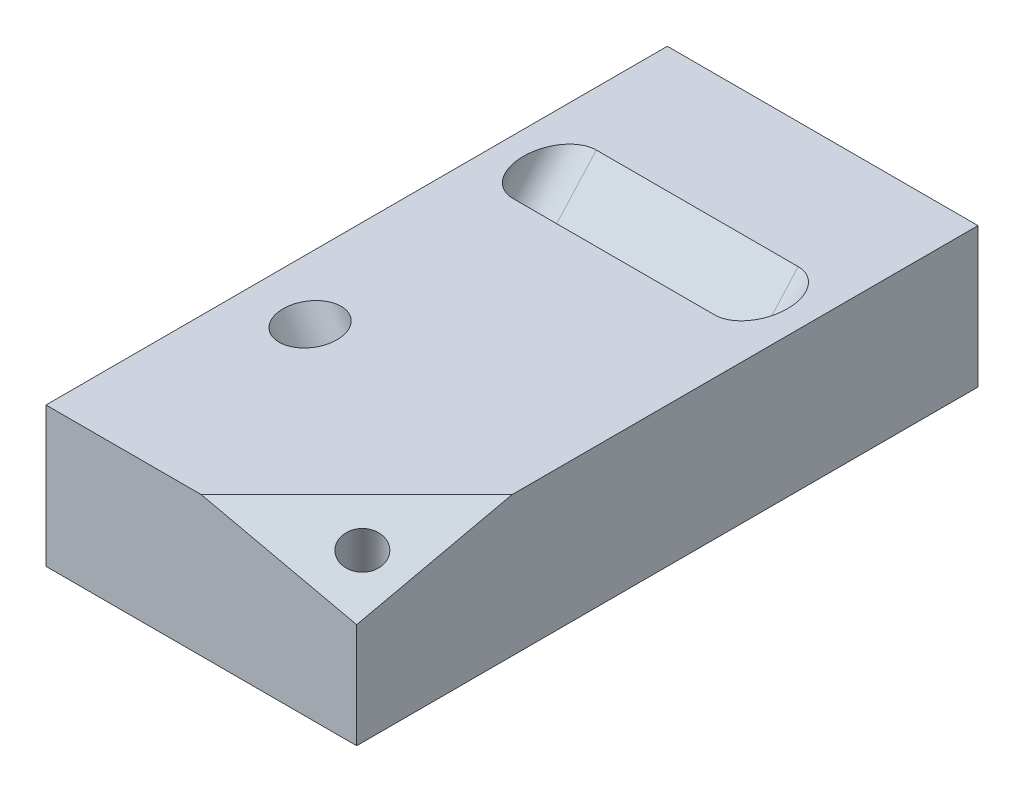
ISO-10303-21;
HEADER;
FILE_DESCRIPTION(('STEP AP214'),'2;1');
FILE_NAME('part.step','',(''),(''),'','','');
FILE_SCHEMA(('AUTOMOTIVE_DESIGN { 1 0 10303 214 1 1 1 1 }'));
ENDSEC;
DATA;
#1=APPLICATION_CONTEXT('core data for automotive mechanical design processes');
#2=APPLICATION_PROTOCOL_DEFINITION('international standard','automotive_design',2000,#1);
#3=PRODUCT_CONTEXT('',#1,'mechanical');
#4=PRODUCT('Part','Part','',(#3));
#5=PRODUCT_RELATED_PRODUCT_CATEGORY('part','',(#4));
#6=PRODUCT_DEFINITION_FORMATION('','',#4);
#7=PRODUCT_DEFINITION_CONTEXT('part definition',#1,'design');
#8=PRODUCT_DEFINITION('design','',#6,#7);
#9=PRODUCT_DEFINITION_SHAPE('','',#8);
#10=(LENGTH_UNIT() NAMED_UNIT(*) SI_UNIT(.MILLI.,.METRE.));
#11=(NAMED_UNIT(*) PLANE_ANGLE_UNIT() SI_UNIT($,.RADIAN.));
#12=(NAMED_UNIT(*) SI_UNIT($,.STERADIAN.) SOLID_ANGLE_UNIT());
#13=UNCERTAINTY_MEASURE_WITH_UNIT(LENGTH_MEASURE(1.E-05),#10,'distance_accuracy_value','');
#14=(GEOMETRIC_REPRESENTATION_CONTEXT(3) GLOBAL_UNCERTAINTY_ASSIGNED_CONTEXT((#13)) GLOBAL_UNIT_ASSIGNED_CONTEXT((#10,
#11,#12)) REPRESENTATION_CONTEXT('',''));
#15=CARTESIAN_POINT('',(0.,0.,0.));
#16=DIRECTION('',(0.,0.,1.));
#17=DIRECTION('',(1.,0.,0.));
#18=AXIS2_PLACEMENT_3D('',#15,#16,#17);
#19=CARTESIAN_POINT('',(100.,90.,200.));
#20=DIRECTION('',(-1.,0.,0.));
#21=DIRECTION('',(0.,0.,1.));
#22=AXIS2_PLACEMENT_3D('',#19,#20,#21);
#23=PLANE('',#22);
#24=DIRECTION('',(0.,-0.219512195121951,0.975609756097561));
#25=VECTOR('',#24,1.);
#26=CARTESIAN_POINT('',(99.9999999999999,90.0000000000001,100.));
#27=LINE('',#26,#25);
#28=CARTESIAN_POINT('',(100.,90.,100.));
#29=VERTEX_POINT('',#28);
#30=CARTESIAN_POINT('',(100.,67.5,200.));
#31=VERTEX_POINT('',#30);
#32=EDGE_CURVE('E170',#29,#31,#27,.T.);
#33=ORIENTED_EDGE('',*,*,#32,.T.);
#34=DIRECTION('',(0.,-1.,0.));
#35=VECTOR('',#34,1.);
#36=CARTESIAN_POINT('',(100.,90.,200.));
#37=LINE('',#36,#35);
#38=CARTESIAN_POINT('',(100.,0.,200.));
#39=VERTEX_POINT('',#38);
#40=EDGE_CURVE('E184',#31,#39,#37,.T.);
#41=ORIENTED_EDGE('',*,*,#40,.T.);
#42=DIRECTION('',(0.,0.,-1.));
#43=VECTOR('',#42,1.);
#44=CARTESIAN_POINT('',(100.,0.,200.));
#45=LINE('',#44,#43);
#46=CARTESIAN_POINT('',(100.,0.,-200.));
#47=VERTEX_POINT('',#46);
#48=EDGE_CURVE('E173',#39,#47,#45,.T.);
#49=ORIENTED_EDGE('',*,*,#48,.T.);
#50=DIRECTION('',(0.,-1.,0.));
#51=VECTOR('',#50,1.);
#52=CARTESIAN_POINT('',(100.,90.,-200.));
#53=LINE('',#52,#51);
#54=CARTESIAN_POINT('',(100.,90.,-200.));
#55=VERTEX_POINT('',#54);
#56=EDGE_CURVE('E111',#55,#47,#53,.T.);
#57=ORIENTED_EDGE('',*,*,#56,.F.);
#58=DIRECTION('',(0.,0.,-1.));
#59=VECTOR('',#58,1.);
#60=CARTESIAN_POINT('',(100.,90.,200.));
#61=LINE('',#60,#59);
#62=EDGE_CURVE('E174',#29,#55,#61,.T.);
#63=ORIENTED_EDGE('',*,*,#62,.F.);
#64=EDGE_LOOP('',(#33,#41,#49,#57,#63));
#65=FACE_BOUND('',#64,.T.);
#66=ADVANCED_FACE('F39',(#65),#23,.F.);
#67=CARTESIAN_POINT('',(-100.,90.,200.));
#68=DIRECTION('',(0.,0.,-1.));
#69=DIRECTION('',(-1.,0.,0.));
#70=AXIS2_PLACEMENT_3D('',#67,#68,#69);
#71=PLANE('',#70);
#72=DIRECTION('',(-0.975609756097561,0.219512195121951,0.));
#73=VECTOR('',#72,1.);
#74=CARTESIAN_POINT('',(100.,67.5,200.));
#75=LINE('',#74,#73);
#76=CARTESIAN_POINT('',(0.,90.,200.));
#77=VERTEX_POINT('',#76);
#78=EDGE_CURVE('E164',#31,#77,#75,.T.);
#79=ORIENTED_EDGE('',*,*,#78,.T.);
#80=DIRECTION('',(1.,0.,0.));
#81=VECTOR('',#80,1.);
#82=CARTESIAN_POINT('',(-100.,90.,200.));
#83=LINE('',#82,#81);
#84=CARTESIAN_POINT('',(-100.,90.,200.));
#85=VERTEX_POINT('',#84);
#86=EDGE_CURVE('E181',#85,#77,#83,.T.);
#87=ORIENTED_EDGE('',*,*,#86,.F.);
#88=DIRECTION('',(0.,-1.,0.));
#89=VECTOR('',#88,1.);
#90=CARTESIAN_POINT('',(-100.,90.,200.));
#91=LINE('',#90,#89);
#92=CARTESIAN_POINT('',(-100.,0.,200.));
#93=VERTEX_POINT('',#92);
#94=EDGE_CURVE('E194',#85,#93,#91,.T.);
#95=ORIENTED_EDGE('',*,*,#94,.T.);
#96=DIRECTION('',(1.,0.,0.));
#97=VECTOR('',#96,1.);
#98=CARTESIAN_POINT('',(-100.,0.,200.));
#99=LINE('',#98,#97);
#100=EDGE_CURVE('E177',#93,#39,#99,.T.);
#101=ORIENTED_EDGE('',*,*,#100,.T.);
#102=ORIENTED_EDGE('',*,*,#40,.F.);
#103=EDGE_LOOP('',(#79,#87,#95,#101,#102));
#104=FACE_BOUND('',#103,.T.);
#105=ADVANCED_FACE('F217',(#104),#71,.F.);
#106=CARTESIAN_POINT('',(0.,90.,0.));
#107=DIRECTION('',(0.,-1.,0.));
#108=DIRECTION('',(0.,0.,-1.));
#109=AXIS2_PLACEMENT_3D('',#106,#107,#108);
#110=PLANE('',#109);
#111=DIRECTION('',(1.,0.,0.));
#112=VECTOR('',#111,1.);
#113=CARTESIAN_POINT('',(0.,90.,-119.262036223617));
#114=LINE('',#113,#112);
#115=CARTESIAN_POINT('',(-65.,90.,-119.262036223617));
#116=VERTEX_POINT('',#115);
#117=CARTESIAN_POINT('',(65.,90.,-119.262036223617));
#118=VERTEX_POINT('',#117);
#119=EDGE_CURVE('E334',#116,#118,#114,.T.);
#120=ORIENTED_EDGE('',*,*,#119,.T.);
#121=CARTESIAN_POINT('',(65.,90.,-92.3493816314897));
#122=DIRECTION('',(0.,-1.,0.));
#123=DIRECTION('',(0.,0.,-1.));
#124=AXIS2_PLACEMENT_3D('',#121,#122,#123);
#125=ELLIPSE('',#124,26.9126545921276,20.);
#126=CARTESIAN_POINT('',(65.,90.,-65.4367270393622));
#127=VERTEX_POINT('',#126);
#128=EDGE_CURVE('E118',#118,#127,#125,.T.);
#129=ORIENTED_EDGE('',*,*,#128,.T.);
#130=DIRECTION('',(1.,0.,0.));
#131=VECTOR('',#130,1.);
#132=CARTESIAN_POINT('',(0.,90.,-65.4367270393622));
#133=LINE('',#132,#131);
#134=CARTESIAN_POINT('',(-65.,90.,-65.4367270393622));
#135=VERTEX_POINT('',#134);
#136=EDGE_CURVE('E339',#135,#127,#133,.T.);
#137=ORIENTED_EDGE('',*,*,#136,.F.);
#138=CARTESIAN_POINT('',(-65.,90.,-92.3493816314897));
#139=DIRECTION('',(0.,-1.,0.));
#140=DIRECTION('',(0.,0.,-1.));
#141=AXIS2_PLACEMENT_3D('',#138,#139,#140);
#142=ELLIPSE('',#141,26.9126545921276,20.);
#143=EDGE_CURVE('E330',#135,#116,#142,.T.);
#144=ORIENTED_EDGE('',*,*,#143,.T.);
#145=EDGE_LOOP('',(#120,#129,#137,#144));
#146=FACE_BOUND('',#145,.T.);
#147=CARTESIAN_POINT('',(-60.0000000000001,90.,50.));
#148=CARTESIAN_POINT('',(-59.7652053283955,90.,49.9999988452972));
#149=CARTESIAN_POINT('',(-59.5304306376043,90.,50.0055146076062));
#150=CARTESIAN_POINT('',(-59.0615251413032,90.,50.0275421938246));
#151=CARTESIAN_POINT('',(-58.827394063033,90.,50.0440482590427));
#152=CARTESIAN_POINT('',(-58.1742145812687,90.,50.1054922984556));
#153=CARTESIAN_POINT('',(-57.7562494179976,90.,50.1626027392273));
#154=CARTESIAN_POINT('',(-56.9263661175837,90.,50.311449284218));
#155=CARTESIAN_POINT('',(-56.514451274401,90.,50.4032035728577));
#156=CARTESIAN_POINT('',(-55.6947360998138,90.,50.6215348289774));
#157=CARTESIAN_POINT('',(-55.2870419531278,90.,50.7485105850292));
#158=CARTESIAN_POINT('',(-54.4833749418192,90.,51.0353387366216));
#159=CARTESIAN_POINT('',(-54.0874030686239,90.,51.1951939039475));
#160=CARTESIAN_POINT('',(-53.3089152512236,90.,51.5462999780631));
#161=CARTESIAN_POINT('',(-52.9264210727341,90.,51.7375990751777));
#162=CARTESIAN_POINT('',(-52.1775383867728,90.,52.1494673927575));
#163=CARTESIAN_POINT('',(-51.8111506781314,90.,52.3700380628252));
#164=CARTESIAN_POINT('',(-51.077908684671,90.,52.850348140272));
#165=CARTESIAN_POINT('',(-50.7119891563375,90.,53.111513959563));
#166=CARTESIAN_POINT('',(-50.001474934222,90.,53.661398042464));
#167=CARTESIAN_POINT('',(-49.6568818199419,90.,53.9501183428303));
#168=CARTESIAN_POINT('',(-48.9906809685199,90.,54.5522960289209));
#169=CARTESIAN_POINT('',(-48.6690510126073,90.,54.8657288677396));
#170=CARTESIAN_POINT('',(-48.0495002435389,90.,55.5150398933948));
#171=CARTESIAN_POINT('',(-47.7515744548936,90.,55.8509133425873));
#172=CARTESIAN_POINT('',(-47.1498502478439,90.,56.579455112673));
#173=CARTESIAN_POINT('',(-46.8487716314138,90.,56.9743711201159));
#174=CARTESIAN_POINT('',(-46.277282999022,90.,57.7856853967356));
#175=CARTESIAN_POINT('',(-46.0068695555349,90.,58.2020812574695));
#176=CARTESIAN_POINT('',(-45.4948454912646,90.,59.0574182573282));
#177=CARTESIAN_POINT('',(-45.253523096637,90.,59.4965317244831));
#178=CARTESIAN_POINT('',(-44.8028969813265,90.,60.3910501717807));
#179=CARTESIAN_POINT('',(-44.5936041903744,90.,60.8464606479712));
#180=CARTESIAN_POINT('',(-44.2072634663421,90.,61.771013985322));
#181=CARTESIAN_POINT('',(-44.0302318749787,90.,62.240163667113));
#182=CARTESIAN_POINT('',(-43.7086675069423,90.,63.189483469836));
#183=CARTESIAN_POINT('',(-43.5641375067785,90.,63.6696545284312));
#184=CARTESIAN_POINT('',(-43.2840661028775,90.,64.727765472262));
#185=CARTESIAN_POINT('',(-43.1550655241902,90.,65.3074461254432));
#186=CARTESIAN_POINT('',(-42.9428868136613,90.,66.4745926962538));
#187=CARTESIAN_POINT('',(-42.8596704965388,90.,67.0620517064322));
#188=CARTESIAN_POINT('',(-42.7388871794467,90.,68.2417418768135));
#189=CARTESIAN_POINT('',(-42.7013279339652,90.,68.8339738304734));
#190=CARTESIAN_POINT('',(-42.6718841854332,90.,70.0196922533776));
#191=CARTESIAN_POINT('',(-42.6800092424899,90.,70.6131789592206));
#192=CARTESIAN_POINT('',(-42.7419544708201,90.,71.7977424571735));
#193=CARTESIAN_POINT('',(-42.7957726863146,90.,72.3888193513413));
#194=CARTESIAN_POINT('',(-42.949095882727,90.,73.5649996637939));
#195=CARTESIAN_POINT('',(-43.0485985763027,90.,74.1501033796463));
#196=CARTESIAN_POINT('',(-43.2932814374751,90.,75.3107604988306));
#197=CARTESIAN_POINT('',(-43.4384661638352,90.,75.8863129429719));
#198=CARTESIAN_POINT('',(-43.7744933001938,90.,77.0241465328505));
#199=CARTESIAN_POINT('',(-43.9653490044202,90.,77.5864237618897));
#200=CARTESIAN_POINT('',(-44.3888201874786,90.,78.6838548759501));
#201=CARTESIAN_POINT('',(-44.6206537951476,90.,79.2193100751441));
#202=CARTESIAN_POINT('',(-45.1279208288465,90.,80.2691912430945));
#203=CARTESIAN_POINT('',(-45.4033525335809,90.,80.7836180410642));
#204=CARTESIAN_POINT('',(-45.9777405157709,90.,81.7540351404949));
#205=CARTESIAN_POINT('',(-46.2739618693368,90.,82.2116441308714));
#206=CARTESIAN_POINT('',(-46.9031629483718,90.,83.1006287039279));
#207=CARTESIAN_POINT('',(-47.2361262953167,90.,83.5320158436189));
#208=CARTESIAN_POINT('',(-47.9138103941635,90.,84.3361388994394));
#209=CARTESIAN_POINT('',(-48.2561656242023,90.,84.7108682647113));
#210=CARTESIAN_POINT('',(-48.9707347184547,90.,85.4307072749091));
#211=CARTESIAN_POINT('',(-49.3429458315239,90.,85.7758196429146));
#212=CARTESIAN_POINT('',(-50.0903823151189,90.,86.4114032220766));
#213=CARTESIAN_POINT('',(-50.4638250144253,90.,86.7039706690662));
#214=CARTESIAN_POINT('',(-51.2336546189204,90.,87.257139407959));
#215=CARTESIAN_POINT('',(-51.6300380225035,90.,87.5177455595044));
#216=CARTESIAN_POINT('',(-52.4209586869913,90.,87.9905622749516));
#217=CARTESIAN_POINT('',(-52.8143672358095,90.,88.2046607528793));
#218=CARTESIAN_POINT('',(-53.6175330844787,90.,88.5994453787394));
#219=CARTESIAN_POINT('',(-54.0272864936262,90.,88.7801394211842));
#220=CARTESIAN_POINT('',(-54.8431659464039,90.,89.0992043165133));
#221=CARTESIAN_POINT('',(-55.2487213604421,90.,89.2390341523805));
#222=CARTESIAN_POINT('',(-56.0703468463312,90.,89.4846265433299));
#223=CARTESIAN_POINT('',(-56.4864239340249,90.0000000000001,89.5903656843326));
#224=CARTESIAN_POINT('',(-57.3212893445125,90.0000000000001,89.7653727072141));
#225=CARTESIAN_POINT('',(-57.7399942149525,90.,89.8350383297135));
#226=CARTESIAN_POINT('',(-58.581939356568,90.,89.9388530625604));
#227=CARTESIAN_POINT('',(-59.0051811343312,90.,89.9729899808278));
#228=CARTESIAN_POINT('',(-59.8535748444583,90.,90.0052968321121));
#229=CARTESIAN_POINT('',(-60.2787285178289,90.,90.0034211287037));
#230=CARTESIAN_POINT('',(-61.1272974604698,90.,89.9636168059096));
#231=CARTESIAN_POINT('',(-61.5507129069006,90.,89.925691957137));
#232=CARTESIAN_POINT('',(-62.3914695275698,90.,89.8144506274045));
#233=CARTESIAN_POINT('',(-62.8088258878297,90.,89.7412486818732));
#234=CARTESIAN_POINT('',(-63.6360319309605,90.,89.5603850025502));
#235=CARTESIAN_POINT('',(-64.0458809067137,90.,89.4527200401661));
#236=CARTESIAN_POINT('',(-64.8548735112772,90.,89.2043460854379));
#237=CARTESIAN_POINT('',(-65.254029639864,90.,89.0636777361914));
#238=CARTESIAN_POINT('',(-66.0396431778818,90.,88.750833663402));
#239=CARTESIAN_POINT('',(-66.4261041570811,90.,88.578666887969));
#240=CARTESIAN_POINT('',(-67.1910519234975,90.,88.2012753590861));
#241=CARTESIAN_POINT('',(-67.5692761202084,90.,87.9955189533775));
#242=CARTESIAN_POINT('',(-68.3085079293332,90.,87.5553080166032));
#243=CARTESIAN_POINT('',(-68.6695188195047,90.,87.3208589797591));
#244=CARTESIAN_POINT('',(-69.3762271530275,90.,86.8229753792021));
#245=CARTESIAN_POINT('',(-69.7217409101227,90.,86.5592804266927));
#246=CARTESIAN_POINT('',(-70.3924163300243,90.,86.0069736522419));
#247=CARTESIAN_POINT('',(-70.7175706844407,90.,85.7183529701983));
#248=CARTESIAN_POINT('',(-71.3464990476752,90.,85.118353015349));
#249=CARTESIAN_POINT('',(-71.6502601785092,90.,84.8069602605603));
#250=CARTESIAN_POINT('',(-72.2353608810002,90.,84.1637630443636));
#251=CARTESIAN_POINT('',(-72.5166981884357,90.,83.8319565276766));
#252=CARTESIAN_POINT('',(-73.0980628566826,90.,83.0972801980343));
#253=CARTESIAN_POINT('',(-73.3942422101112,90.,82.6913606623502));
#254=CARTESIAN_POINT('',(-73.9547963648439,90.,81.8587266189492));
#255=CARTESIAN_POINT('',(-74.2192002055038,90.,81.4320316067507));
#256=CARTESIAN_POINT('',(-74.7160152219459,90.,80.5604916128314));
#257=CARTESIAN_POINT('',(-74.9484301924193,90.,80.115648792031));
#258=CARTESIAN_POINT('',(-75.3810442719969,90.,79.2104295740401));
#259=CARTESIAN_POINT('',(-75.5812325653466,90.,78.7500480242672));
#260=CARTESIAN_POINT('',(-75.9927227406751,90.,77.7058082361404));
#261=CARTESIAN_POINT('',(-76.1954176356903,90.,77.1185412713255));
#262=CARTESIAN_POINT('',(-76.550941439348,90.,75.9288578286583));
#263=CARTESIAN_POINT('',(-76.7037457486539,90.,75.3264340346852));
#264=CARTESIAN_POINT('',(-76.9592284205133,90.,74.1113743388705));
#265=CARTESIAN_POINT('',(-77.0619315037063,90.,73.498743627896));
#266=CARTESIAN_POINT('',(-77.2172874383968,90.,72.2672658207651));
#267=CARTESIAN_POINT('',(-77.2699467976985,90.,71.6484195434759));
#268=CARTESIAN_POINT('',(-77.3252374570808,90.,70.4085122745555));
#269=CARTESIAN_POINT('',(-77.3278697125436,90.,69.787451325445));
#270=CARTESIAN_POINT('',(-77.2831083121336,90.,68.5471357426293));
#271=CARTESIAN_POINT('',(-77.2357150643711,90.,67.9278810942296));
#272=CARTESIAN_POINT('',(-77.0908781405753,90.,66.6950070436764));
#273=CARTESIAN_POINT('',(-76.9934157931142,90.,66.081389830749));
#274=CARTESIAN_POINT('',(-76.7485049683716,90.,64.864492622782));
#275=CARTESIAN_POINT('',(-76.6010806560502,90.,64.261207778226));
#276=CARTESIAN_POINT('',(-76.2619099069974,90.,63.0884081703043));
#277=CARTESIAN_POINT('',(-76.0717569012247,90.,62.5184328222461));
#278=CARTESIAN_POINT('',(-75.6448607313489,90.,61.3961217504185));
#279=CARTESIAN_POINT('',(-75.4081157363628,90.,60.8437867208364));
#280=CARTESIAN_POINT('',(-74.9038288090781,90.,59.7934645366025));
#281=CARTESIAN_POINT('',(-74.6389516797555,90.,59.294197982421));
#282=CARTESIAN_POINT('',(-74.0688728063608,90.,58.3194724577631));
#283=CARTESIAN_POINT('',(-73.7636894521788,90.,57.8440027654768));
#284=CARTESIAN_POINT('',(-73.1356041634943,90.,56.9520503353424));
#285=CARTESIAN_POINT('',(-72.8152811620761,90.,56.5337516765975));
#286=CARTESIAN_POINT('',(-72.141104226953,90.,55.7250916946355));
#287=CARTESIAN_POINT('',(-71.7872535364096,90.,55.3347276756762));
#288=CARTESIAN_POINT('',(-71.0724675879108,90.,54.6112262897382));
#289=CARTESIAN_POINT('',(-70.7136437731973,90.,54.2760030475195));
#290=CARTESIAN_POINT('',(-69.9694810005794,90.,53.6364427792518));
#291=CARTESIAN_POINT('',(-69.5841463516714,90.,53.3321007536649));
#292=CARTESIAN_POINT('',(-68.813211876941,90.,52.7751658005505));
#293=CARTESIAN_POINT('',(-68.4290780278664,90.,52.5205437440852));
#294=CARTESIAN_POINT('',(-67.641090726467,90.,52.0440751375838));
#295=CARTESIAN_POINT('',(-67.2372429298184,90.,51.822219260029));
#296=CARTESIAN_POINT('',(-66.4327070529351,90.,51.4239516017289));
#297=CARTESIAN_POINT('',(-66.0328683552507,90.,51.2458236640911));
#298=CARTESIAN_POINT('',(-65.2194086743483,90.,50.9232143834853));
#299=CARTESIAN_POINT('',(-64.8057766243922,90.,50.7787608387121));
#300=CARTESIAN_POINT('',(-64.031658005488,90.,50.5447331938309));
#301=CARTESIAN_POINT('',(-63.672677450732,90.,50.4501507379123));
#302=CARTESIAN_POINT('',(-62.9486535498927,90.,50.2873484795657));
#303=CARTESIAN_POINT('',(-62.5836084546363,90.,50.2191364257358));
#304=CARTESIAN_POINT('',(-61.849746392029,90.,50.1097932608259));
#305=CARTESIAN_POINT('',(-61.480932189366,90.,50.0686435702482));
#306=CARTESIAN_POINT('',(-60.7413948158697,90.,50.0137535836262));
#307=CARTESIAN_POINT('',(-60.3706725086171,90.,50.00000182294));
#308=CARTESIAN_POINT('',(-60.0000000000001,90.,50.));
#309=B_SPLINE_CURVE_WITH_KNOTS('',3,(#147,#148,#149,#150,#151,#152,#153,#154,#155,#156,#157,
#158,#159,#160,#161,#162,#163,#164,#165,#166,#167,#168,#169,#170,#171,#172,#173,#174,#175,#176,
#177,#178,#179,#180,#181,#182,#183,#184,#185,#186,#187,#188,#189,#190,#191,#192,#193,#194,#195,
#196,#197,#198,#199,#200,#201,#202,#203,#204,#205,#206,#207,#208,#209,#210,#211,#212,#213,#214,
#215,#216,#217,#218,#219,#220,#221,#222,#223,#224,#225,#226,#227,#228,#229,#230,#231,#232,#233,
#234,#235,#236,#237,#238,#239,#240,#241,#242,#243,#244,#245,#246,#247,#248,#249,#250,#251,#252,
#253,#254,#255,#256,#257,#258,#259,#260,#261,#262,#263,#264,#265,#266,#267,#268,#269,#270,#271,
#272,#273,#274,#275,#276,#277,#278,#279,#280,#281,#282,#283,#284,#285,#286,#287,#288,#289,#290,
#291,#292,#293,#294,#295,#296,#297,#298,#299,#300,#301,#302,#303,#304,#305,#306,#307,#308),
.UNSPECIFIED.,.T.,.F.,(4,2,2,2,2,2,2,2,2,2,2,2,2,2,2,2,2,2,2,2,2,2,2,2,2,2,2,2,2,2,2,2,2,2,2,2,
2,2,2,2,2,2,2,2,2,2,2,2,2,2,2,2,2,2,2,2,2,2,2,2,2,2,2,2,2,2,2,2,2,2,2,2,2,2,2,2,2,2,2,2,4),(0.,
0.70427754607296,1.40818635538272,2.67213748356031,3.93675297915549,5.21631637396286,
6.49598768218688,7.77763879444036,9.05935340100595,10.4066288679982,11.7540039993707,
13.1000572507397,14.4458272169239,15.9341267406679,17.4222597490314,18.9240991046956,
20.4264498083553,21.9295594161566,23.4327973811715,25.212479156842,26.9906743721993,
28.7691715575998,30.5480409333436,32.3268341729591,34.1055383612029,35.8844201086354,
37.6638202966489,39.4123520395183,41.160814765858,42.7943899860214,44.4272399247728,
45.9483024863577,47.4692250465188,48.8908697132445,50.3122979534425,51.6544933123456,
52.996371061878,54.2818823668264,55.56827471158,56.8401641401555,58.1124898883347,
59.3864280774982,60.6602330318876,61.9299298590439,63.1997456698055,64.4680058572234,
65.7359063136657,67.0262704376852,68.3163878612028,69.6190874819109,70.9222520814407,
72.2261945522915,73.5302685209724,75.0362041899935,76.540752959964,78.0451230981855,
79.5499970776307,81.4114638738476,83.2738471142808,85.1353104972038,86.9965317778876,
88.8577175142572,90.7188880671083,92.5807531793673,94.4417190508314,96.2422986568354,
98.0429490327116,99.7366363961973,101.429553659917,103.008416455514,104.587126682006,
106.058670995054,107.529976689921,108.911037063623,110.291703531179,111.603420223598,
112.916215933093,114.0289691791,115.142049145043,116.254364132876,117.366213575546),.UNSPECIFIED.);
#310=CARTESIAN_POINT('',(-60.0000000000001,90.,50.));
#311=VERTEX_POINT('',#310);
#312=EDGE_CURVE('E129',#311,#311,#309,.T.);
#313=ORIENTED_EDGE('',*,*,#312,.T.);
#314=EDGE_LOOP('',(#313));
#315=FACE_BOUND('',#314,.T.);
#316=DIRECTION('',(0.707106781186547,0.,-0.707106781186548));
#317=VECTOR('',#316,1.);
#318=CARTESIAN_POINT('',(0.,90.,200.));
#319=LINE('',#318,#317);
#320=EDGE_CURVE('E167',#77,#29,#319,.T.);
#321=ORIENTED_EDGE('',*,*,#320,.T.);
#322=ORIENTED_EDGE('',*,*,#62,.T.);
#323=DIRECTION('',(-1.,0.,0.));
#324=VECTOR('',#323,1.);
#325=CARTESIAN_POINT('',(-100.,90.,-200.));
#326=LINE('',#325,#324);
#327=CARTESIAN_POINT('',(-100.,90.,-200.));
#328=VERTEX_POINT('',#327);
#329=EDGE_CURVE('E176',#55,#328,#326,.T.);
#330=ORIENTED_EDGE('',*,*,#329,.T.);
#331=DIRECTION('',(0.,0.,1.));
#332=VECTOR('',#331,1.);
#333=CARTESIAN_POINT('',(-100.,90.,200.));
#334=LINE('',#333,#332);
#335=EDGE_CURVE('E179',#328,#85,#334,.T.);
#336=ORIENTED_EDGE('',*,*,#335,.T.);
#337=ORIENTED_EDGE('',*,*,#86,.T.);
#338=EDGE_LOOP('',(#321,#322,#330,#336,#337));
#339=FACE_BOUND('',#338,.T.);
#340=ADVANCED_FACE('F140',(#146,#315,#339),#110,.F.);
#341=CARTESIAN_POINT('',(-100.,90.,-200.));
#342=DIRECTION('',(0.,0.,1.));
#343=DIRECTION('',(1.,0.,0.));
#344=AXIS2_PLACEMENT_3D('',#341,#342,#343);
#345=PLANE('',#344);
#346=DIRECTION('',(-1.,0.,0.));
#347=VECTOR('',#346,1.);
#348=CARTESIAN_POINT('',(-100.,0.,-200.));
#349=LINE('',#348,#347);
#350=CARTESIAN_POINT('',(-100.,0.,-200.));
#351=VERTEX_POINT('',#350);
#352=EDGE_CURVE('E187',#47,#351,#349,.T.);
#353=ORIENTED_EDGE('',*,*,#352,.T.);
#354=DIRECTION('',(0.,-1.,0.));
#355=VECTOR('',#354,1.);
#356=CARTESIAN_POINT('',(-100.,90.,-200.));
#357=LINE('',#356,#355);
#358=EDGE_CURVE('E196',#328,#351,#357,.T.);
#359=ORIENTED_EDGE('',*,*,#358,.F.);
#360=ORIENTED_EDGE('',*,*,#329,.F.);
#361=ORIENTED_EDGE('',*,*,#56,.T.);
#362=EDGE_LOOP('',(#353,#359,#360,#361));
#363=FACE_BOUND('',#362,.T.);
#364=ADVANCED_FACE('F206',(#363),#345,.F.);
#365=CARTESIAN_POINT('',(-100.,90.,200.));
#366=DIRECTION('',(1.,0.,0.));
#367=DIRECTION('',(0.,0.,-1.));
#368=AXIS2_PLACEMENT_3D('',#365,#366,#367);
#369=PLANE('',#368);
#370=DIRECTION('',(0.,0.,1.));
#371=VECTOR('',#370,1.);
#372=CARTESIAN_POINT('',(-100.,0.,200.));
#373=LINE('',#372,#371);
#374=EDGE_CURVE('E189',#351,#93,#373,.T.);
#375=ORIENTED_EDGE('',*,*,#374,.T.);
#376=ORIENTED_EDGE('',*,*,#94,.F.);
#377=ORIENTED_EDGE('',*,*,#335,.F.);
#378=ORIENTED_EDGE('',*,*,#358,.T.);
#379=EDGE_LOOP('',(#375,#376,#377,#378));
#380=FACE_BOUND('',#379,.T.);
#381=ADVANCED_FACE('F214',(#380),#369,.F.);
#382=CARTESIAN_POINT('',(0.,0.,0.));
#383=DIRECTION('',(0.,-1.,0.));
#384=DIRECTION('',(0.,0.,-1.));
#385=AXIS2_PLACEMENT_3D('',#382,#383,#384);
#386=PLANE('',#385);
#387=CARTESIAN_POINT('',(65.,0.,-11.3130176446839));
#388=DIRECTION('',(0.,-1.,0.));
#389=DIRECTION('',(0.,0.,-1.));
#390=AXIS2_PLACEMENT_3D('',#387,#388,#389);
#391=ELLIPSE('',#390,26.9126545921276,20.);
#392=CARTESIAN_POINT('',(65.,0.,-38.2256722368114));
#393=VERTEX_POINT('',#392);
#394=CARTESIAN_POINT('',(65.,0.,15.5996369474437));
#395=VERTEX_POINT('',#394);
#396=EDGE_CURVE('E11',#393,#395,#391,.T.);
#397=ORIENTED_EDGE('',*,*,#396,.F.);
#398=DIRECTION('',(1.,0.,0.));
#399=VECTOR('',#398,1.);
#400=CARTESIAN_POINT('',(0.,0.,-38.2256722368114));
#401=LINE('',#400,#399);
#402=CARTESIAN_POINT('',(-65.,0.,-38.2256722368114));
#403=VERTEX_POINT('',#402);
#404=EDGE_CURVE('E105',#403,#393,#401,.T.);
#405=ORIENTED_EDGE('',*,*,#404,.F.);
#406=CARTESIAN_POINT('',(-65.,0.,-11.3130176446838));
#407=DIRECTION('',(0.,-1.,0.));
#408=DIRECTION('',(0.,0.,-1.));
#409=AXIS2_PLACEMENT_3D('',#406,#407,#408);
#410=ELLIPSE('',#409,26.9126545921276,20.);
#411=CARTESIAN_POINT('',(-65.,0.,15.5996369474437));
#412=VERTEX_POINT('',#411);
#413=EDGE_CURVE('E110',#412,#403,#410,.T.);
#414=ORIENTED_EDGE('',*,*,#413,.F.);
#415=DIRECTION('',(1.,0.,0.));
#416=VECTOR('',#415,1.);
#417=CARTESIAN_POINT('',(0.,0.,15.5996369474437));
#418=LINE('',#417,#416);
#419=EDGE_CURVE('E46',#412,#395,#418,.T.);
#420=ORIENTED_EDGE('',*,*,#419,.T.);
#421=EDGE_LOOP('',(#397,#405,#414,#420));
#422=FACE_BOUND('',#421,.T.);
#423=CARTESIAN_POINT('',(55.1744586259158,0.,151.5));
#424=DIRECTION('',(0.,-1.,0.));
#425=DIRECTION('',(0.707106781186548,0.,0.707106781186548));
#426=AXIS2_PLACEMENT_3D('',#423,#424,#425);
#427=ELLIPSE('',#426,13.1175574136346,12.5);
#428=CARTESIAN_POINT('',(64.4499724257007,0.,160.775513799785));
#429=VERTEX_POINT('',#428);
#430=EDGE_CURVE('E161',#429,#429,#427,.F.);
#431=ORIENTED_EDGE('',*,*,#430,.T.);
#432=EDGE_LOOP('',(#431));
#433=FACE_BOUND('',#432,.T.);
#434=ORIENTED_EDGE('',*,*,#48,.F.);
#435=ORIENTED_EDGE('',*,*,#100,.F.);
#436=ORIENTED_EDGE('',*,*,#374,.F.);
#437=ORIENTED_EDGE('',*,*,#352,.F.);
#438=EDGE_LOOP('',(#434,#435,#436,#437));
#439=FACE_BOUND('',#438,.T.);
#440=ADVANCED_FACE('F122',(#422,#433,#439),#386,.T.);
#441=CARTESIAN_POINT('',(27.5822928490352,122.587968217934,27.5822928490352));
#442=DIRECTION('',(0.214407294842609,0.952921310411594,0.214407294842609));
#443=DIRECTION('',(0.,-0.219512195121951,0.975609756097561));
#444=AXIS2_PLACEMENT_3D('',#441,#442,#443);
#445=PLANE('',#444);
#446=CARTESIAN_POINT('',(73.2558257378913,80.36163160878,169.581367111976));
#447=DIRECTION('',(-0.214407294842609,-0.952921310411594,-0.214407294842609));
#448=DIRECTION('',(0.,0.219512195121951,-0.975609756097561));
#449=AXIS2_PLACEMENT_3D('',#446,#447,#448);
#450=CIRCLE('',#449,12.5);
#451=CARTESIAN_POINT('',(73.2558257378913,83.1055340478044,157.386245160756));
#452=VERTEX_POINT('',#451);
#453=EDGE_CURVE('E137',#452,#452,#450,.T.);
#454=ORIENTED_EDGE('',*,*,#453,.T.);
#455=EDGE_LOOP('',(#454));
#456=FACE_BOUND('',#455,.T.);
#457=ORIENTED_EDGE('',*,*,#78,.F.);
#458=ORIENTED_EDGE('',*,*,#32,.F.);
#459=ORIENTED_EDGE('',*,*,#320,.F.);
#460=EDGE_LOOP('',(#457,#458,#459));
#461=FACE_BOUND('',#460,.T.);
#462=ADVANCED_FACE('F220',(#456,#461),#445,.T.);
#463=CARTESIAN_POINT('',(31.8823864643385,-103.520320718121,128.207927838423));
#464=DIRECTION('',(0.214407294842609,0.952921310411594,0.214407294842609));
#465=DIRECTION('',(0.,-0.219512195121951,0.975609756097561));
#466=AXIS2_PLACEMENT_3D('',#463,#464,#465);
#467=CYLINDRICAL_SURFACE('',#466,12.5);
#468=ORIENTED_EDGE('',*,*,#430,.F.);
#469=EDGE_LOOP('',(#468));
#470=FACE_BOUND('',#469,.T.);
#471=ORIENTED_EDGE('',*,*,#453,.F.);
#472=EDGE_LOOP('',(#471));
#473=FACE_BOUND('',#472,.T.);
#474=ADVANCED_FACE('F151',(#470,#473),#467,.F.);
#475=CARTESIAN_POINT('',(-20.,20.717967697245,70.));
#476=DIRECTION('',(-0.500000000000001,0.866025403784438,0.));
#477=DIRECTION('',(0.,0.,-1.));
#478=AXIS2_PLACEMENT_3D('',#475,#476,#477);
#479=ELLIPSE('',#478,20.,15.);
#480=DIRECTION('',(-0.500000000000001,0.866025403784438,0.));
#481=VECTOR('',#480,1.);
#482=SURFACE_OF_LINEAR_EXTRUSION('',#479,#481);
#483=CARTESIAN_POINT('',(-20.,20.717967697245,50.));
#484=VERTEX_POINT('',#483);
#485=EDGE_CURVE('E138',#484,#484,#479,.T.);
#486=ORIENTED_EDGE('',*,*,#485,.F.);
#487=EDGE_LOOP('',(#486));
#488=FACE_BOUND('',#487,.T.);
#489=ORIENTED_EDGE('',*,*,#312,.F.);
#490=EDGE_LOOP('',(#489));
#491=FACE_BOUND('',#490,.T.);
#492=ADVANCED_FACE('F144',(#488,#491),#482,.F.);
#493=CARTESIAN_POINT('',(-20.,20.717967697245,70.));
#494=DIRECTION('',(-0.500000000000001,0.866025403784438,0.));
#495=DIRECTION('',(-0.866025403784438,-0.500000000000001,0.));
#496=AXIS2_PLACEMENT_3D('',#493,#494,#495);
#497=PLANE('',#496);
#498=ORIENTED_EDGE('',*,*,#485,.T.);
#499=EDGE_LOOP('',(#498));
#500=FACE_BOUND('',#499,.T.);
#501=ADVANCED_FACE('F150',(#500),#497,.T.);
#502=CARTESIAN_POINT('',(65.,-105.07771141199,83.2993786762338));
#503=DIRECTION('',(0.,0.743144825477393,-0.669130606358859));
#504=DIRECTION('',(0.,0.669130606358859,0.743144825477393));
#505=AXIS2_PLACEMENT_3D('',#502,#503,#504);
#506=CYLINDRICAL_SURFACE('',#505,20.);
#507=DIRECTION('',(0.,0.743144825477393,-0.669130606358859));
#508=VECTOR('',#507,1.);
#509=CARTESIAN_POINT('',(65.,-118.460323539168,68.436482166686));
#510=LINE('',#509,#508);
#511=EDGE_CURVE('E53',#393,#118,#510,.T.);
#512=ORIENTED_EDGE('',*,*,#511,.F.);
#513=ORIENTED_EDGE('',*,*,#396,.T.);
#514=DIRECTION('',(0.,0.743144825477393,-0.669130606358859));
#515=VECTOR('',#514,1.);
#516=CARTESIAN_POINT('',(65.,-91.6950992848132,98.1622751857817));
#517=LINE('',#516,#515);
#518=EDGE_CURVE('E332',#395,#127,#517,.T.);
#519=ORIENTED_EDGE('',*,*,#518,.T.);
#520=ORIENTED_EDGE('',*,*,#128,.F.);
#521=EDGE_LOOP('',(#512,#513,#519,#520));
#522=FACE_BOUND('',#521,.T.);
#523=ADVANCED_FACE('F114',(#522),#506,.F.);
#524=CARTESIAN_POINT('',(65.,-91.6950992848132,98.1622751857817));
#525=DIRECTION('',(0.,-0.669130606358859,-0.743144825477393));
#526=DIRECTION('',(0.,0.743144825477393,-0.669130606358859));
#527=AXIS2_PLACEMENT_3D('',#524,#525,#526);
#528=PLANE('',#527);
#529=ORIENTED_EDGE('',*,*,#136,.T.);
#530=ORIENTED_EDGE('',*,*,#518,.F.);
#531=ORIENTED_EDGE('',*,*,#419,.F.);
#532=DIRECTION('',(0.,0.743144825477393,-0.669130606358859));
#533=VECTOR('',#532,1.);
#534=CARTESIAN_POINT('',(-65.,-91.6950992848132,98.1622751857817));
#535=LINE('',#534,#533);
#536=EDGE_CURVE('E328',#412,#135,#535,.T.);
#537=ORIENTED_EDGE('',*,*,#536,.T.);
#538=EDGE_LOOP('',(#529,#530,#531,#537));
#539=FACE_BOUND('',#538,.T.);
#540=ADVANCED_FACE('F300',(#539),#528,.T.);
#541=CARTESIAN_POINT('',(-65.,-105.07771141199,83.2993786762338));
#542=DIRECTION('',(0.,0.743144825477393,-0.669130606358859));
#543=DIRECTION('',(0.,0.669130606358859,0.743144825477393));
#544=AXIS2_PLACEMENT_3D('',#541,#542,#543);
#545=CYLINDRICAL_SURFACE('',#544,20.);
#546=ORIENTED_EDGE('',*,*,#536,.F.);
#547=ORIENTED_EDGE('',*,*,#413,.T.);
#548=DIRECTION('',(0.,0.743144825477393,-0.669130606358859));
#549=VECTOR('',#548,1.);
#550=CARTESIAN_POINT('',(-65.,-118.460323539168,68.436482166686));
#551=LINE('',#550,#549);
#552=EDGE_CURVE('E58',#403,#116,#551,.T.);
#553=ORIENTED_EDGE('',*,*,#552,.T.);
#554=ORIENTED_EDGE('',*,*,#143,.F.);
#555=EDGE_LOOP('',(#546,#547,#553,#554));
#556=FACE_BOUND('',#555,.T.);
#557=ADVANCED_FACE('F308',(#556),#545,.F.);
#558=CARTESIAN_POINT('',(65.,-118.460323539168,68.436482166686));
#559=DIRECTION('',(0.,-0.669130606358859,-0.743144825477393));
#560=DIRECTION('',(0.,0.743144825477393,-0.669130606358859));
#561=AXIS2_PLACEMENT_3D('',#558,#559,#560);
#562=PLANE('',#561);
#563=ORIENTED_EDGE('',*,*,#552,.F.);
#564=ORIENTED_EDGE('',*,*,#404,.T.);
#565=ORIENTED_EDGE('',*,*,#511,.T.);
#566=ORIENTED_EDGE('',*,*,#119,.F.);
#567=EDGE_LOOP('',(#563,#564,#565,#566));
#568=FACE_BOUND('',#567,.T.);
#569=ADVANCED_FACE('F106',(#568),#562,.F.);
#570=CLOSED_SHELL('',(#66,#105,#340,#364,#381,#440,#462,#474,#492,#501,#523,#540,#557,#569));
#571=MANIFOLD_SOLID_BREP('B2',#570);
#572=ADVANCED_BREP_SHAPE_REPRESENTATION('',(#18,#571),#14);
#573=SHAPE_DEFINITION_REPRESENTATION(#9,#572);
ENDSEC;
END-ISO-10303-21;
